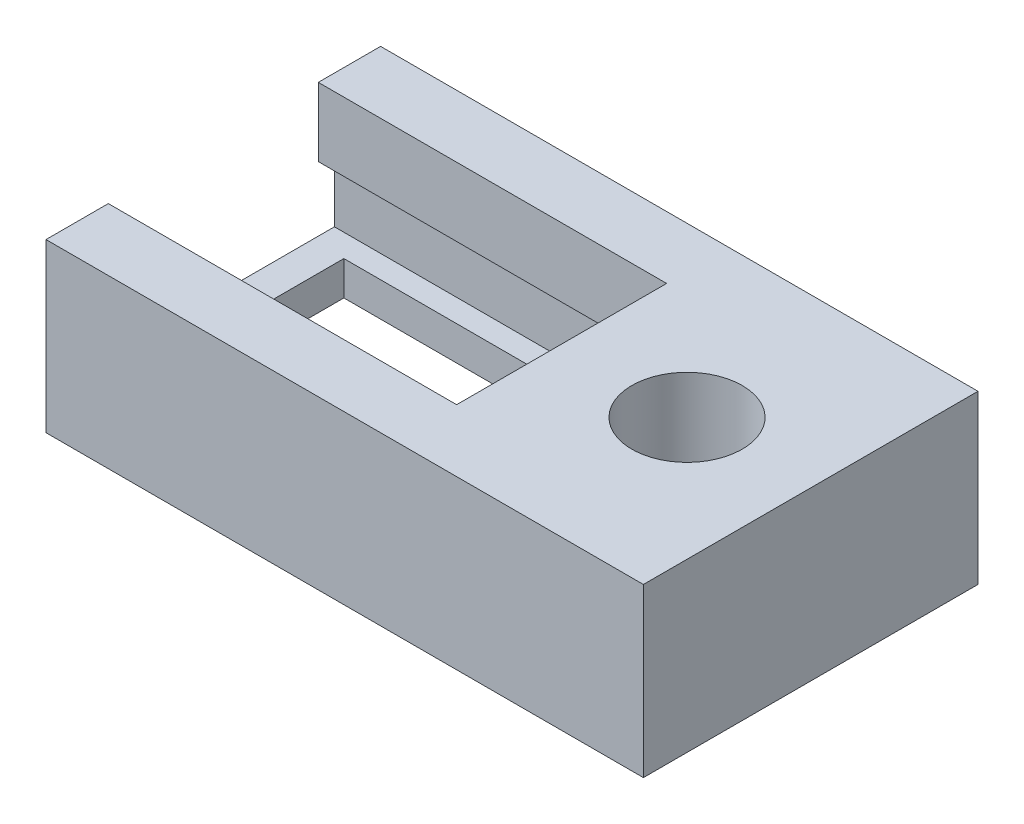
ISO-10303-21;
HEADER;
FILE_DESCRIPTION(('STEP AP214'),'2;1');
FILE_NAME('part.step','',(''),(''),'','','');
FILE_SCHEMA(('AUTOMOTIVE_DESIGN { 1 0 10303 214 1 1 1 1 }'));
ENDSEC;
DATA;
#1=APPLICATION_CONTEXT('core data for automotive mechanical design processes');
#2=APPLICATION_PROTOCOL_DEFINITION('international standard','automotive_design',2000,#1);
#3=PRODUCT_CONTEXT('',#1,'mechanical');
#4=PRODUCT('Part','Part','',(#3));
#5=PRODUCT_RELATED_PRODUCT_CATEGORY('part','',(#4));
#6=PRODUCT_DEFINITION_FORMATION('','',#4);
#7=PRODUCT_DEFINITION_CONTEXT('part definition',#1,'design');
#8=PRODUCT_DEFINITION('design','',#6,#7);
#9=PRODUCT_DEFINITION_SHAPE('','',#8);
#10=(LENGTH_UNIT() NAMED_UNIT(*) SI_UNIT(.MILLI.,.METRE.));
#11=(NAMED_UNIT(*) PLANE_ANGLE_UNIT() SI_UNIT($,.RADIAN.));
#12=(NAMED_UNIT(*) SI_UNIT($,.STERADIAN.) SOLID_ANGLE_UNIT());
#13=UNCERTAINTY_MEASURE_WITH_UNIT(LENGTH_MEASURE(1.E-05),#10,'distance_accuracy_value','');
#14=(GEOMETRIC_REPRESENTATION_CONTEXT(3) GLOBAL_UNCERTAINTY_ASSIGNED_CONTEXT((#13)) GLOBAL_UNIT_ASSIGNED_CONTEXT((#10,
#11,#12)) REPRESENTATION_CONTEXT('',''));
#15=CARTESIAN_POINT('',(0.,0.,0.));
#16=DIRECTION('',(0.,0.,1.));
#17=DIRECTION('',(1.,0.,0.));
#18=AXIS2_PLACEMENT_3D('',#15,#16,#17);
#19=CARTESIAN_POINT('',(-2.85370671793953,5.,5.));
#20=DIRECTION('',(1.,0.,0.));
#21=DIRECTION('',(0.,0.,-1.));
#22=AXIS2_PLACEMENT_3D('',#19,#20,#21);
#23=PLANE('',#22);
#24=DIRECTION('',(0.,-1.,0.));
#25=VECTOR('',#24,1.);
#26=CARTESIAN_POINT('',(-2.85370671793953,5.,-3.13772099917543));
#27=LINE('',#26,#25);
#28=CARTESIAN_POINT('',(-2.85370671793953,5.,-3.13772099917543));
#29=VERTEX_POINT('',#28);
#30=CARTESIAN_POINT('',(-2.85370671793953,2.94806403711325,-3.13772099917543));
#31=VERTEX_POINT('',#30);
#32=EDGE_CURVE('E255',#29,#31,#27,.T.);
#33=ORIENTED_EDGE('',*,*,#32,.F.);
#34=DIRECTION('',(0.,0.,1.));
#35=VECTOR('',#34,1.);
#36=CARTESIAN_POINT('',(-2.85370671793953,5.,5.));
#37=LINE('',#36,#35);
#38=CARTESIAN_POINT('',(-2.85370671793952,5.,-5.));
#39=VERTEX_POINT('',#38);
#40=EDGE_CURVE('E316',#39,#29,#37,.T.);
#41=ORIENTED_EDGE('',*,*,#40,.F.);
#42=DIRECTION('',(0.,-1.,0.));
#43=VECTOR('',#42,1.);
#44=CARTESIAN_POINT('',(-2.85370671793952,5.,-5.));
#45=LINE('',#44,#43);
#46=CARTESIAN_POINT('',(-2.85370671793952,0.,-5.));
#47=VERTEX_POINT('',#46);
#48=EDGE_CURVE('E349',#39,#47,#45,.T.);
#49=ORIENTED_EDGE('',*,*,#48,.T.);
#50=DIRECTION('',(0.,0.,1.));
#51=VECTOR('',#50,1.);
#52=CARTESIAN_POINT('',(-2.85370671793953,0.,5.));
#53=LINE('',#52,#51);
#54=CARTESIAN_POINT('',(-2.85370671793953,0.,5.));
#55=VERTEX_POINT('',#54);
#56=EDGE_CURVE('E330',#47,#55,#53,.T.);
#57=ORIENTED_EDGE('',*,*,#56,.T.);
#58=DIRECTION('',(0.,-1.,0.));
#59=VECTOR('',#58,1.);
#60=CARTESIAN_POINT('',(-2.85370671793953,5.,5.));
#61=LINE('',#60,#59);
#62=CARTESIAN_POINT('',(-2.85370671793953,5.,5.));
#63=VERTEX_POINT('',#62);
#64=EDGE_CURVE('E345',#63,#55,#61,.T.);
#65=ORIENTED_EDGE('',*,*,#64,.F.);
#66=CARTESIAN_POINT('',(-2.85370671793953,5.,3.13772099917543));
#67=VERTEX_POINT('',#66);
#68=EDGE_CURVE('E314',#67,#63,#37,.T.);
#69=ORIENTED_EDGE('',*,*,#68,.F.);
#70=DIRECTION('',(0.,1.,0.));
#71=VECTOR('',#70,1.);
#72=CARTESIAN_POINT('',(-2.85370671793953,5.,3.13772099917543));
#73=LINE('',#72,#71);
#74=CARTESIAN_POINT('',(-2.85370671793953,2.94806403711325,3.13772099917543));
#75=VERTEX_POINT('',#74);
#76=EDGE_CURVE('E246',#75,#67,#73,.T.);
#77=ORIENTED_EDGE('',*,*,#76,.F.);
#78=DIRECTION('',(0.,0.,-1.));
#79=VECTOR('',#78,1.);
#80=CARTESIAN_POINT('',(-2.85370671793953,2.94806403711325,3.48));
#81=LINE('',#80,#79);
#82=CARTESIAN_POINT('',(-2.85370671793953,2.94806403711325,3.48));
#83=VERTEX_POINT('',#82);
#84=EDGE_CURVE('E267',#83,#75,#81,.T.);
#85=ORIENTED_EDGE('',*,*,#84,.F.);
#86=DIRECTION('',(0.,1.,0.));
#87=VECTOR('',#86,1.);
#88=CARTESIAN_POINT('',(-2.85370671793953,1.02,3.48));
#89=LINE('',#88,#87);
#90=CARTESIAN_POINT('',(-2.85370671793953,1.02,3.48));
#91=VERTEX_POINT('',#90);
#92=EDGE_CURVE('E287',#91,#83,#89,.T.);
#93=ORIENTED_EDGE('',*,*,#92,.F.);
#94=DIRECTION('',(0.,0.,1.));
#95=VECTOR('',#94,1.);
#96=CARTESIAN_POINT('',(-2.85370671793953,1.02,3.48));
#97=LINE('',#96,#95);
#98=CARTESIAN_POINT('',(-2.85370671793953,1.02,-3.62));
#99=VERTEX_POINT('',#98);
#100=EDGE_CURVE('E284',#99,#91,#97,.T.);
#101=ORIENTED_EDGE('',*,*,#100,.F.);
#102=DIRECTION('',(0.,-1.,0.));
#103=VECTOR('',#102,1.);
#104=CARTESIAN_POINT('',(-2.85370671793953,1.02,-3.62));
#105=LINE('',#104,#103);
#106=CARTESIAN_POINT('',(-2.85370671793953,2.94806403711325,-3.62));
#107=VERTEX_POINT('',#106);
#108=EDGE_CURVE('E261',#107,#99,#105,.T.);
#109=ORIENTED_EDGE('',*,*,#108,.F.);
#110=EDGE_CURVE('E291',#31,#107,#81,.T.);
#111=ORIENTED_EDGE('',*,*,#110,.F.);
#112=EDGE_LOOP('',(#33,#41,#49,#57,#65,#69,#77,#85,#93,#101,#109,#111));
#113=FACE_BOUND('',#112,.T.);
#114=ADVANCED_FACE('F45',(#113),#23,.F.);
#115=CARTESIAN_POINT('',(0.,5.,0.));
#116=DIRECTION('',(0.,-1.,0.));
#117=DIRECTION('',(0.,0.,-1.));
#118=AXIS2_PLACEMENT_3D('',#115,#116,#117);
#119=PLANE('',#118);
#120=CARTESIAN_POINT('',(11.3268693268383,5.,0.0230991374057218));
#121=DIRECTION('',(0.,-1.,0.));
#122=DIRECTION('',(0.,0.,-1.));
#123=AXIS2_PLACEMENT_3D('',#120,#121,#122);
#124=CIRCLE('',#123,1.65);
#125=CARTESIAN_POINT('',(11.3268693268383,5.,-1.62690086259428));
#126=VERTEX_POINT('',#125);
#127=EDGE_CURVE('E219',#126,#126,#124,.T.);
#128=ORIENTED_EDGE('',*,*,#127,.T.);
#129=EDGE_LOOP('',(#128));
#130=FACE_BOUND('',#129,.T.);
#131=DIRECTION('',(-1.,0.,0.));
#132=VECTOR('',#131,1.);
#133=CARTESIAN_POINT('',(0.,5.,-3.13772099917543));
#134=LINE('',#133,#132);
#135=CARTESIAN_POINT('',(7.55639633478555,5.,-3.13772099917543));
#136=VERTEX_POINT('',#135);
#137=EDGE_CURVE('E258',#136,#29,#134,.T.);
#138=ORIENTED_EDGE('',*,*,#137,.F.);
#139=DIRECTION('',(0.,0.,-1.));
#140=VECTOR('',#139,1.);
#141=CARTESIAN_POINT('',(7.55639633478555,5.,0.));
#142=LINE('',#141,#140);
#143=CARTESIAN_POINT('',(7.55639633478555,5.,3.13772099917543));
#144=VERTEX_POINT('',#143);
#145=EDGE_CURVE('E11',#144,#136,#142,.T.);
#146=ORIENTED_EDGE('',*,*,#145,.F.);
#147=DIRECTION('',(1.,0.,0.));
#148=VECTOR('',#147,1.);
#149=CARTESIAN_POINT('',(0.,5.,3.13772099917543));
#150=LINE('',#149,#148);
#151=EDGE_CURVE('E249',#67,#144,#150,.T.);
#152=ORIENTED_EDGE('',*,*,#151,.F.);
#153=ORIENTED_EDGE('',*,*,#68,.T.);
#154=DIRECTION('',(1.,0.,0.));
#155=VECTOR('',#154,1.);
#156=CARTESIAN_POINT('',(15.,5.,5.));
#157=LINE('',#156,#155);
#158=CARTESIAN_POINT('',(15.,5.,5.));
#159=VERTEX_POINT('',#158);
#160=EDGE_CURVE('E320',#63,#159,#157,.T.);
#161=ORIENTED_EDGE('',*,*,#160,.T.);
#162=DIRECTION('',(0.,0.,-1.));
#163=VECTOR('',#162,1.);
#164=CARTESIAN_POINT('',(15.,5.,-5.));
#165=LINE('',#164,#163);
#166=CARTESIAN_POINT('',(15.,5.,-5.));
#167=VERTEX_POINT('',#166);
#168=EDGE_CURVE('E323',#159,#167,#165,.T.);
#169=ORIENTED_EDGE('',*,*,#168,.T.);
#170=DIRECTION('',(-1.,0.,0.));
#171=VECTOR('',#170,1.);
#172=CARTESIAN_POINT('',(-2.85370671793952,5.,-5.));
#173=LINE('',#172,#171);
#174=EDGE_CURVE('E310',#167,#39,#173,.T.);
#175=ORIENTED_EDGE('',*,*,#174,.T.);
#176=ORIENTED_EDGE('',*,*,#40,.T.);
#177=EDGE_LOOP('',(#138,#146,#152,#153,#161,#169,#175,#176));
#178=FACE_BOUND('',#177,.T.);
#179=ADVANCED_FACE('F405',(#130,#178),#119,.F.);
#180=CARTESIAN_POINT('',(6.44629328206048,2.94806403711325,3.48));
#181=DIRECTION('',(0.,1.,0.));
#182=DIRECTION('',(0.,0.,1.));
#183=AXIS2_PLACEMENT_3D('',#180,#181,#182);
#184=PLANE('',#183);
#185=DIRECTION('',(1.,0.,0.));
#186=VECTOR('',#185,1.);
#187=CARTESIAN_POINT('',(6.44629328206048,2.94806403711325,-3.13772099917543));
#188=LINE('',#187,#186);
#189=CARTESIAN_POINT('',(6.44629328206048,2.94806403711325,-3.13772099917543));
#190=VERTEX_POINT('',#189);
#191=EDGE_CURVE('E252',#31,#190,#188,.T.);
#192=ORIENTED_EDGE('',*,*,#191,.F.);
#193=ORIENTED_EDGE('',*,*,#110,.T.);
#194=DIRECTION('',(-1.,0.,0.));
#195=VECTOR('',#194,1.);
#196=CARTESIAN_POINT('',(6.44629328206048,2.94806403711325,-3.62));
#197=LINE('',#196,#195);
#198=CARTESIAN_POINT('',(6.44629328206048,2.94806403711325,-3.62));
#199=VERTEX_POINT('',#198);
#200=EDGE_CURVE('E295',#199,#107,#197,.T.);
#201=ORIENTED_EDGE('',*,*,#200,.F.);
#202=DIRECTION('',(0.,0.,-1.));
#203=VECTOR('',#202,1.);
#204=CARTESIAN_POINT('',(6.44629328206048,2.94806403711325,3.48));
#205=LINE('',#204,#203);
#206=EDGE_CURVE('E276',#190,#199,#205,.T.);
#207=ORIENTED_EDGE('',*,*,#206,.F.);
#208=EDGE_LOOP('',(#192,#193,#201,#207));
#209=FACE_BOUND('',#208,.T.);
#210=ADVANCED_FACE('F368',(#209),#184,.F.);
#211=DIRECTION('',(-1.,0.,0.));
#212=VECTOR('',#211,1.);
#213=CARTESIAN_POINT('',(6.44629328206048,2.94806403711325,3.13772099917543));
#214=LINE('',#213,#212);
#215=CARTESIAN_POINT('',(6.44629328206048,2.94806403711325,3.13772099917543));
#216=VERTEX_POINT('',#215);
#217=EDGE_CURVE('E243',#216,#75,#214,.T.);
#218=ORIENTED_EDGE('',*,*,#217,.F.);
#219=CARTESIAN_POINT('',(6.44629328206048,2.94806403711325,3.48));
#220=VERTEX_POINT('',#219);
#221=EDGE_CURVE('E277',#220,#216,#205,.T.);
#222=ORIENTED_EDGE('',*,*,#221,.F.);
#223=DIRECTION('',(-1.,0.,0.));
#224=VECTOR('',#223,1.);
#225=CARTESIAN_POINT('',(6.44629328206048,2.94806403711325,3.48));
#226=LINE('',#225,#224);
#227=EDGE_CURVE('E300',#220,#83,#226,.T.);
#228=ORIENTED_EDGE('',*,*,#227,.T.);
#229=ORIENTED_EDGE('',*,*,#84,.T.);
#230=EDGE_LOOP('',(#218,#222,#228,#229));
#231=FACE_BOUND('',#230,.T.);
#232=ADVANCED_FACE('F394',(#231),#184,.F.);
#233=CARTESIAN_POINT('',(6.44629328206048,0.,0.));
#234=DIRECTION('',(-1.,0.,0.));
#235=DIRECTION('',(0.,0.,1.));
#236=AXIS2_PLACEMENT_3D('',#233,#234,#235);
#237=PLANE('',#236);
#238=DIRECTION('',(0.,0.,1.));
#239=VECTOR('',#238,1.);
#240=CARTESIAN_POINT('',(6.44629328206048,1.02,3.48));
#241=LINE('',#240,#239);
#242=CARTESIAN_POINT('',(6.44629328206048,1.02,-3.62));
#243=VERTEX_POINT('',#242);
#244=CARTESIAN_POINT('',(6.44629328206048,1.02,-3.13772099917543));
#245=VERTEX_POINT('',#244);
#246=EDGE_CURVE('E268',#243,#245,#241,.T.);
#247=ORIENTED_EDGE('',*,*,#246,.T.);
#248=DIRECTION('',(0.,1.,0.));
#249=VECTOR('',#248,1.);
#250=CARTESIAN_POINT('',(6.44629328206048,0.,-3.13772099917543));
#251=LINE('',#250,#249);
#252=EDGE_CURVE('E54',#245,#190,#251,.T.);
#253=ORIENTED_EDGE('',*,*,#252,.T.);
#254=ORIENTED_EDGE('',*,*,#206,.T.);
#255=DIRECTION('',(0.,-1.,0.));
#256=VECTOR('',#255,1.);
#257=CARTESIAN_POINT('',(6.44629328206048,1.02,-3.62));
#258=LINE('',#257,#256);
#259=EDGE_CURVE('E262',#199,#243,#258,.T.);
#260=ORIENTED_EDGE('',*,*,#259,.T.);
#261=EDGE_LOOP('',(#247,#253,#254,#260));
#262=FACE_BOUND('',#261,.T.);
#263=ADVANCED_FACE('F361',(#262),#237,.T.);
#264=ORIENTED_EDGE('',*,*,#221,.T.);
#265=DIRECTION('',(0.,-1.,0.));
#266=VECTOR('',#265,1.);
#267=CARTESIAN_POINT('',(6.44629328206048,0.,3.13772099917543));
#268=LINE('',#267,#266);
#269=CARTESIAN_POINT('',(6.44629328206048,1.02,3.13772099917543));
#270=VERTEX_POINT('',#269);
#271=EDGE_CURVE('E353',#216,#270,#268,.T.);
#272=ORIENTED_EDGE('',*,*,#271,.T.);
#273=CARTESIAN_POINT('',(6.44629328206048,1.02,3.48));
#274=VERTEX_POINT('',#273);
#275=EDGE_CURVE('E266',#270,#274,#241,.T.);
#276=ORIENTED_EDGE('',*,*,#275,.T.);
#277=DIRECTION('',(0.,1.,0.));
#278=VECTOR('',#277,1.);
#279=CARTESIAN_POINT('',(6.44629328206048,1.02,3.48));
#280=LINE('',#279,#278);
#281=EDGE_CURVE('E272',#274,#220,#280,.T.);
#282=ORIENTED_EDGE('',*,*,#281,.T.);
#283=EDGE_LOOP('',(#264,#272,#276,#282));
#284=FACE_BOUND('',#283,.T.);
#285=ADVANCED_FACE('F391',(#284),#237,.T.);
#286=CARTESIAN_POINT('',(-2.85370671793952,5.,-5.));
#287=DIRECTION('',(0.,0.,1.));
#288=DIRECTION('',(1.,0.,0.));
#289=AXIS2_PLACEMENT_3D('',#286,#287,#288);
#290=PLANE('',#289);
#291=DIRECTION('',(-1.,0.,0.));
#292=VECTOR('',#291,1.);
#293=CARTESIAN_POINT('',(-2.85370671793952,0.,-5.));
#294=LINE('',#293,#292);
#295=CARTESIAN_POINT('',(15.,0.,-5.));
#296=VERTEX_POINT('',#295);
#297=EDGE_CURVE('E299',#296,#47,#294,.T.);
#298=ORIENTED_EDGE('',*,*,#297,.T.);
#299=ORIENTED_EDGE('',*,*,#48,.F.);
#300=ORIENTED_EDGE('',*,*,#174,.F.);
#301=DIRECTION('',(0.,-1.,0.));
#302=VECTOR('',#301,1.);
#303=CARTESIAN_POINT('',(15.,5.,-5.));
#304=LINE('',#303,#302);
#305=EDGE_CURVE('E326',#167,#296,#304,.T.);
#306=ORIENTED_EDGE('',*,*,#305,.T.);
#307=EDGE_LOOP('',(#298,#299,#300,#306));
#308=FACE_BOUND('',#307,.T.);
#309=ADVANCED_FACE('F47',(#308),#290,.F.);
#310=CARTESIAN_POINT('',(15.,5.,5.));
#311=DIRECTION('',(0.,0.,-1.));
#312=DIRECTION('',(-1.,0.,0.));
#313=AXIS2_PLACEMENT_3D('',#310,#311,#312);
#314=PLANE('',#313);
#315=DIRECTION('',(1.,0.,0.));
#316=VECTOR('',#315,1.);
#317=CARTESIAN_POINT('',(15.,0.,5.));
#318=LINE('',#317,#316);
#319=CARTESIAN_POINT('',(15.,0.,5.));
#320=VERTEX_POINT('',#319);
#321=EDGE_CURVE('E333',#55,#320,#318,.T.);
#322=ORIENTED_EDGE('',*,*,#321,.T.);
#323=DIRECTION('',(0.,-1.,0.));
#324=VECTOR('',#323,1.);
#325=CARTESIAN_POINT('',(15.,5.,5.));
#326=LINE('',#325,#324);
#327=EDGE_CURVE('E341',#159,#320,#326,.T.);
#328=ORIENTED_EDGE('',*,*,#327,.F.);
#329=ORIENTED_EDGE('',*,*,#160,.F.);
#330=ORIENTED_EDGE('',*,*,#64,.T.);
#331=EDGE_LOOP('',(#322,#328,#329,#330));
#332=FACE_BOUND('',#331,.T.);
#333=ADVANCED_FACE('F423',(#332),#314,.F.);
#334=CARTESIAN_POINT('',(15.,5.,-5.));
#335=DIRECTION('',(-1.,0.,0.));
#336=DIRECTION('',(0.,0.,1.));
#337=AXIS2_PLACEMENT_3D('',#334,#335,#336);
#338=PLANE('',#337);
#339=DIRECTION('',(0.,0.,-1.));
#340=VECTOR('',#339,1.);
#341=CARTESIAN_POINT('',(15.,0.,-5.));
#342=LINE('',#341,#340);
#343=EDGE_CURVE('E315',#320,#296,#342,.T.);
#344=ORIENTED_EDGE('',*,*,#343,.T.);
#345=ORIENTED_EDGE('',*,*,#305,.F.);
#346=ORIENTED_EDGE('',*,*,#168,.F.);
#347=ORIENTED_EDGE('',*,*,#327,.T.);
#348=EDGE_LOOP('',(#344,#345,#346,#347));
#349=FACE_BOUND('',#348,.T.);
#350=ADVANCED_FACE('F426',(#349),#338,.F.);
#351=CARTESIAN_POINT('',(0.,0.,0.));
#352=DIRECTION('',(0.,-1.,0.));
#353=DIRECTION('',(0.,0.,-1.));
#354=AXIS2_PLACEMENT_3D('',#351,#352,#353);
#355=PLANE('',#354);
#356=DIRECTION('',(0.,0.,1.));
#357=VECTOR('',#356,1.);
#358=CARTESIAN_POINT('',(-1.89050399244746,0.,2.88525039881078));
#359=LINE('',#358,#357);
#360=CARTESIAN_POINT('',(-1.89050399244746,0.,-2.93918031280722));
#361=VERTEX_POINT('',#360);
#362=CARTESIAN_POINT('',(-1.89050399244746,0.,2.88525039881078));
#363=VERTEX_POINT('',#362);
#364=EDGE_CURVE('E172',#361,#363,#359,.T.);
#365=ORIENTED_EDGE('',*,*,#364,.T.);
#366=DIRECTION('',(1.,0.,0.));
#367=VECTOR('',#366,1.);
#368=CARTESIAN_POINT('',(7.27758138695124,0.,2.88525039881078));
#369=LINE('',#368,#367);
#370=CARTESIAN_POINT('',(7.27758138695124,0.,2.88525039881078));
#371=VERTEX_POINT('',#370);
#372=EDGE_CURVE('E182',#363,#371,#369,.T.);
#373=ORIENTED_EDGE('',*,*,#372,.T.);
#374=DIRECTION('',(0.,0.,-1.));
#375=VECTOR('',#374,1.);
#376=CARTESIAN_POINT('',(7.27758138695124,0.,-2.93918031280722));
#377=LINE('',#376,#375);
#378=CARTESIAN_POINT('',(7.27758138695124,0.,-2.93918031280722));
#379=VERTEX_POINT('',#378);
#380=EDGE_CURVE('E61',#371,#379,#377,.T.);
#381=ORIENTED_EDGE('',*,*,#380,.T.);
#382=DIRECTION('',(-1.,0.,0.));
#383=VECTOR('',#382,1.);
#384=CARTESIAN_POINT('',(-1.89050399244746,0.,-2.93918031280722));
#385=LINE('',#384,#383);
#386=EDGE_CURVE('E179',#379,#361,#385,.T.);
#387=ORIENTED_EDGE('',*,*,#386,.T.);
#388=EDGE_LOOP('',(#365,#373,#381,#387));
#389=FACE_BOUND('',#388,.T.);
#390=CARTESIAN_POINT('',(11.3268693268383,0.,0.0230991374057218));
#391=DIRECTION('',(0.,-1.,0.));
#392=DIRECTION('',(0.,0.,-1.));
#393=AXIS2_PLACEMENT_3D('',#390,#391,#392);
#394=CIRCLE('',#393,1.65);
#395=CARTESIAN_POINT('',(11.3268693268383,0.,-1.62690086259428));
#396=VERTEX_POINT('',#395);
#397=EDGE_CURVE('E213',#396,#396,#394,.T.);
#398=ORIENTED_EDGE('',*,*,#397,.F.);
#399=EDGE_LOOP('',(#398));
#400=FACE_BOUND('',#399,.T.);
#401=ORIENTED_EDGE('',*,*,#297,.F.);
#402=ORIENTED_EDGE('',*,*,#343,.F.);
#403=ORIENTED_EDGE('',*,*,#321,.F.);
#404=ORIENTED_EDGE('',*,*,#56,.F.);
#405=EDGE_LOOP('',(#401,#402,#403,#404));
#406=FACE_BOUND('',#405,.T.);
#407=ADVANCED_FACE('F187',(#389,#400,#406),#355,.T.);
#408=CARTESIAN_POINT('',(6.44629328206048,1.02,-3.62));
#409=DIRECTION('',(0.,0.,-1.));
#410=DIRECTION('',(-1.,0.,0.));
#411=AXIS2_PLACEMENT_3D('',#408,#409,#410);
#412=PLANE('',#411);
#413=ORIENTED_EDGE('',*,*,#108,.T.);
#414=DIRECTION('',(-1.,0.,0.));
#415=VECTOR('',#414,1.);
#416=CARTESIAN_POINT('',(6.44629328206048,1.02,-3.62));
#417=LINE('',#416,#415);
#418=EDGE_CURVE('E281',#243,#99,#417,.T.);
#419=ORIENTED_EDGE('',*,*,#418,.F.);
#420=ORIENTED_EDGE('',*,*,#259,.F.);
#421=ORIENTED_EDGE('',*,*,#200,.T.);
#422=EDGE_LOOP('',(#413,#419,#420,#421));
#423=FACE_BOUND('',#422,.T.);
#424=ADVANCED_FACE('F378',(#423),#412,.F.);
#425=CARTESIAN_POINT('',(6.44629328206048,1.02,3.48));
#426=DIRECTION('',(0.,0.,1.));
#427=DIRECTION('',(1.,0.,0.));
#428=AXIS2_PLACEMENT_3D('',#425,#426,#427);
#429=PLANE('',#428);
#430=ORIENTED_EDGE('',*,*,#92,.T.);
#431=ORIENTED_EDGE('',*,*,#227,.F.);
#432=ORIENTED_EDGE('',*,*,#281,.F.);
#433=DIRECTION('',(-1.,0.,0.));
#434=VECTOR('',#433,1.);
#435=CARTESIAN_POINT('',(6.44629328206048,1.02,3.48));
#436=LINE('',#435,#434);
#437=EDGE_CURVE('E303',#274,#91,#436,.T.);
#438=ORIENTED_EDGE('',*,*,#437,.T.);
#439=EDGE_LOOP('',(#430,#431,#432,#438));
#440=FACE_BOUND('',#439,.T.);
#441=ADVANCED_FACE('F388',(#440),#429,.F.);
#442=CARTESIAN_POINT('',(6.44629328206048,1.02,3.48));
#443=DIRECTION('',(0.,-1.,0.));
#444=DIRECTION('',(0.,0.,-1.));
#445=AXIS2_PLACEMENT_3D('',#442,#443,#444);
#446=PLANE('',#445);
#447=DIRECTION('',(1.,0.,0.));
#448=VECTOR('',#447,1.);
#449=CARTESIAN_POINT('',(7.27758138695124,1.02,2.88525039881078));
#450=LINE('',#449,#448);
#451=CARTESIAN_POINT('',(-1.89050399244746,1.02,2.88525039881078));
#452=VERTEX_POINT('',#451);
#453=CARTESIAN_POINT('',(7.27758138695124,1.02,2.88525039881078));
#454=VERTEX_POINT('',#453);
#455=EDGE_CURVE('E204',#452,#454,#450,.T.);
#456=ORIENTED_EDGE('',*,*,#455,.F.);
#457=DIRECTION('',(0.,0.,1.));
#458=VECTOR('',#457,1.);
#459=CARTESIAN_POINT('',(-1.89050399244746,1.02,2.88525039881078));
#460=LINE('',#459,#458);
#461=CARTESIAN_POINT('',(-1.89050399244746,1.02,-2.93918031280722));
#462=VERTEX_POINT('',#461);
#463=EDGE_CURVE('E69',#462,#452,#460,.T.);
#464=ORIENTED_EDGE('',*,*,#463,.F.);
#465=DIRECTION('',(-1.,0.,0.));
#466=VECTOR('',#465,1.);
#467=CARTESIAN_POINT('',(-1.89050399244746,1.02,-2.93918031280722));
#468=LINE('',#467,#466);
#469=CARTESIAN_POINT('',(7.27758138695124,1.02,-2.93918031280722));
#470=VERTEX_POINT('',#469);
#471=EDGE_CURVE('E191',#470,#462,#468,.T.);
#472=ORIENTED_EDGE('',*,*,#471,.F.);
#473=DIRECTION('',(0.,0.,-1.));
#474=VECTOR('',#473,1.);
#475=CARTESIAN_POINT('',(7.27758138695124,1.02,-2.93918031280722));
#476=LINE('',#475,#474);
#477=EDGE_CURVE('E195',#454,#470,#476,.T.);
#478=ORIENTED_EDGE('',*,*,#477,.F.);
#479=EDGE_LOOP('',(#456,#464,#472,#478));
#480=FACE_BOUND('',#479,.T.);
#481=ORIENTED_EDGE('',*,*,#100,.T.);
#482=ORIENTED_EDGE('',*,*,#437,.F.);
#483=ORIENTED_EDGE('',*,*,#275,.F.);
#484=DIRECTION('',(1.,0.,0.));
#485=VECTOR('',#484,1.);
#486=CARTESIAN_POINT('',(6.44629328206048,1.02,3.13772099917543));
#487=LINE('',#486,#485);
#488=CARTESIAN_POINT('',(7.55639633478555,1.02,3.13772099917543));
#489=VERTEX_POINT('',#488);
#490=EDGE_CURVE('E229',#270,#489,#487,.T.);
#491=ORIENTED_EDGE('',*,*,#490,.T.);
#492=DIRECTION('',(0.,0.,-1.));
#493=VECTOR('',#492,1.);
#494=CARTESIAN_POINT('',(7.55639633478555,1.02,3.48));
#495=LINE('',#494,#493);
#496=CARTESIAN_POINT('',(7.55639633478555,1.02,-3.13772099917543));
#497=VERTEX_POINT('',#496);
#498=EDGE_CURVE('E233',#489,#497,#495,.T.);
#499=ORIENTED_EDGE('',*,*,#498,.T.);
#500=DIRECTION('',(-1.,0.,0.));
#501=VECTOR('',#500,1.);
#502=CARTESIAN_POINT('',(6.44629328206048,1.02,-3.13772099917543));
#503=LINE('',#502,#501);
#504=EDGE_CURVE('E223',#497,#245,#503,.T.);
#505=ORIENTED_EDGE('',*,*,#504,.T.);
#506=ORIENTED_EDGE('',*,*,#246,.F.);
#507=ORIENTED_EDGE('',*,*,#418,.T.);
#508=EDGE_LOOP('',(#481,#482,#483,#491,#499,#505,#506,#507));
#509=FACE_BOUND('',#508,.T.);
#510=ADVANCED_FACE('F384',(#480,#509),#446,.F.);
#511=CARTESIAN_POINT('',(7.55639633478555,10.32,3.48));
#512=DIRECTION('',(-1.,0.,0.));
#513=DIRECTION('',(0.,0.,1.));
#514=AXIS2_PLACEMENT_3D('',#511,#512,#513);
#515=PLANE('',#514);
#516=ORIENTED_EDGE('',*,*,#145,.T.);
#517=DIRECTION('',(0.,-1.,0.));
#518=VECTOR('',#517,1.);
#519=CARTESIAN_POINT('',(7.55639633478555,10.32,-3.13772099917543));
#520=LINE('',#519,#518);
#521=EDGE_CURVE('E237',#136,#497,#520,.T.);
#522=ORIENTED_EDGE('',*,*,#521,.T.);
#523=ORIENTED_EDGE('',*,*,#498,.F.);
#524=DIRECTION('',(0.,-1.,0.));
#525=VECTOR('',#524,1.);
#526=CARTESIAN_POINT('',(7.55639633478555,10.32,3.13772099917543));
#527=LINE('',#526,#525);
#528=EDGE_CURVE('E240',#144,#489,#527,.T.);
#529=ORIENTED_EDGE('',*,*,#528,.F.);
#530=EDGE_LOOP('',(#516,#522,#523,#529));
#531=FACE_BOUND('',#530,.T.);
#532=ADVANCED_FACE('F411',(#531),#515,.T.);
#533=CARTESIAN_POINT('',(6.44629328206048,10.32,-3.13772099917543));
#534=DIRECTION('',(0.,0.,1.));
#535=DIRECTION('',(1.,0.,0.));
#536=AXIS2_PLACEMENT_3D('',#533,#534,#535);
#537=PLANE('',#536);
#538=ORIENTED_EDGE('',*,*,#137,.T.);
#539=ORIENTED_EDGE('',*,*,#32,.T.);
#540=ORIENTED_EDGE('',*,*,#191,.T.);
#541=ORIENTED_EDGE('',*,*,#252,.F.);
#542=ORIENTED_EDGE('',*,*,#504,.F.);
#543=ORIENTED_EDGE('',*,*,#521,.F.);
#544=EDGE_LOOP('',(#538,#539,#540,#541,#542,#543));
#545=FACE_BOUND('',#544,.T.);
#546=ADVANCED_FACE('F413',(#545),#537,.T.);
#547=CARTESIAN_POINT('',(6.44629328206048,10.32,3.13772099917543));
#548=DIRECTION('',(0.,0.,-1.));
#549=DIRECTION('',(-1.,0.,0.));
#550=AXIS2_PLACEMENT_3D('',#547,#548,#549);
#551=PLANE('',#550);
#552=ORIENTED_EDGE('',*,*,#151,.T.);
#553=ORIENTED_EDGE('',*,*,#528,.T.);
#554=ORIENTED_EDGE('',*,*,#490,.F.);
#555=ORIENTED_EDGE('',*,*,#271,.F.);
#556=ORIENTED_EDGE('',*,*,#217,.T.);
#557=ORIENTED_EDGE('',*,*,#76,.T.);
#558=EDGE_LOOP('',(#552,#553,#554,#555,#556,#557));
#559=FACE_BOUND('',#558,.T.);
#560=ADVANCED_FACE('F397',(#559),#551,.T.);
#561=CARTESIAN_POINT('',(11.3268693268383,5.,0.0230991374057218));
#562=DIRECTION('',(0.,-1.,0.));
#563=DIRECTION('',(0.,0.,-1.));
#564=AXIS2_PLACEMENT_3D('',#561,#562,#563);
#565=CYLINDRICAL_SURFACE('',#564,1.65);
#566=ORIENTED_EDGE('',*,*,#127,.F.);
#567=EDGE_LOOP('',(#566));
#568=FACE_BOUND('',#567,.T.);
#569=ORIENTED_EDGE('',*,*,#397,.T.);
#570=EDGE_LOOP('',(#569));
#571=FACE_BOUND('',#570,.T.);
#572=ADVANCED_FACE('F460',(#568,#571),#565,.F.);
#573=CARTESIAN_POINT('',(-1.89050399244746,0.,2.88525039881078));
#574=DIRECTION('',(-1.,0.,0.));
#575=DIRECTION('',(0.,0.,1.));
#576=AXIS2_PLACEMENT_3D('',#573,#574,#575);
#577=PLANE('',#576);
#578=ORIENTED_EDGE('',*,*,#463,.T.);
#579=DIRECTION('',(0.,1.,0.));
#580=VECTOR('',#579,1.);
#581=CARTESIAN_POINT('',(-1.89050399244746,0.,2.88525039881078));
#582=LINE('',#581,#580);
#583=EDGE_CURVE('E168',#363,#452,#582,.T.);
#584=ORIENTED_EDGE('',*,*,#583,.F.);
#585=ORIENTED_EDGE('',*,*,#364,.F.);
#586=DIRECTION('',(0.,1.,0.));
#587=VECTOR('',#586,1.);
#588=CARTESIAN_POINT('',(-1.89050399244746,0.,-2.93918031280722));
#589=LINE('',#588,#587);
#590=EDGE_CURVE('E210',#361,#462,#589,.T.);
#591=ORIENTED_EDGE('',*,*,#590,.T.);
#592=EDGE_LOOP('',(#578,#584,#585,#591));
#593=FACE_BOUND('',#592,.T.);
#594=ADVANCED_FACE('F170',(#593),#577,.F.);
#595=CARTESIAN_POINT('',(-1.89050399244746,0.,-2.93918031280722));
#596=DIRECTION('',(0.,0.,-1.));
#597=DIRECTION('',(0.,1.,0.));
#598=AXIS2_PLACEMENT_3D('',#595,#596,#597);
#599=PLANE('',#598);
#600=ORIENTED_EDGE('',*,*,#471,.T.);
#601=ORIENTED_EDGE('',*,*,#590,.F.);
#602=ORIENTED_EDGE('',*,*,#386,.F.);
#603=DIRECTION('',(0.,1.,0.));
#604=VECTOR('',#603,1.);
#605=CARTESIAN_POINT('',(7.27758138695124,0.,-2.93918031280722));
#606=LINE('',#605,#604);
#607=EDGE_CURVE('E214',#379,#470,#606,.T.);
#608=ORIENTED_EDGE('',*,*,#607,.T.);
#609=EDGE_LOOP('',(#600,#601,#602,#608));
#610=FACE_BOUND('',#609,.T.);
#611=ADVANCED_FACE('F467',(#610),#599,.F.);
#612=CARTESIAN_POINT('',(7.27758138695124,0.,-2.93918031280722));
#613=DIRECTION('',(1.,0.,0.));
#614=DIRECTION('',(0.,0.,-1.));
#615=AXIS2_PLACEMENT_3D('',#612,#613,#614);
#616=PLANE('',#615);
#617=ORIENTED_EDGE('',*,*,#477,.T.);
#618=ORIENTED_EDGE('',*,*,#607,.F.);
#619=ORIENTED_EDGE('',*,*,#380,.F.);
#620=DIRECTION('',(0.,1.,0.));
#621=VECTOR('',#620,1.);
#622=CARTESIAN_POINT('',(7.27758138695124,0.,2.88525039881078));
#623=LINE('',#622,#621);
#624=EDGE_CURVE('E178',#371,#454,#623,.T.);
#625=ORIENTED_EDGE('',*,*,#624,.T.);
#626=EDGE_LOOP('',(#617,#618,#619,#625));
#627=FACE_BOUND('',#626,.T.);
#628=ADVANCED_FACE('F470',(#627),#616,.F.);
#629=CARTESIAN_POINT('',(7.27758138695124,0.,2.88525039881078));
#630=DIRECTION('',(0.,0.,1.));
#631=DIRECTION('',(0.,-1.,0.));
#632=AXIS2_PLACEMENT_3D('',#629,#630,#631);
#633=PLANE('',#632);
#634=ORIENTED_EDGE('',*,*,#455,.T.);
#635=ORIENTED_EDGE('',*,*,#624,.F.);
#636=ORIENTED_EDGE('',*,*,#372,.F.);
#637=ORIENTED_EDGE('',*,*,#583,.T.);
#638=EDGE_LOOP('',(#634,#635,#636,#637));
#639=FACE_BOUND('',#638,.T.);
#640=ADVANCED_FACE('F183',(#639),#633,.F.);
#641=CLOSED_SHELL('',(#114,#179,#210,#232,#263,#285,#309,#333,#350,#407,#424,#441,#510,#532,
#546,#560,#572,#594,#611,#628,#640));
#642=MANIFOLD_SOLID_BREP('B2',#641);
#643=ADVANCED_BREP_SHAPE_REPRESENTATION('',(#18,#642),#14);
#644=SHAPE_DEFINITION_REPRESENTATION(#9,#643);
ENDSEC;
END-ISO-10303-21;
